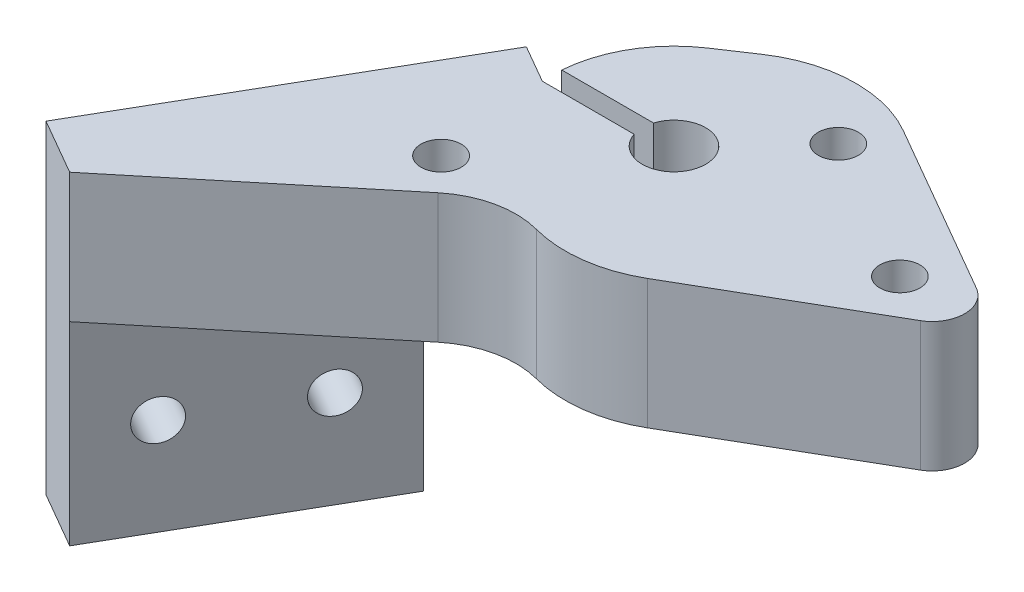
ISO-10303-21;
HEADER;
FILE_DESCRIPTION(('STEP AP214'),'2;1');
FILE_NAME('part.step','',(''),(''),'','','');
FILE_SCHEMA(('AUTOMOTIVE_DESIGN { 1 0 10303 214 1 1 1 1 }'));
ENDSEC;
DATA;
#1=APPLICATION_CONTEXT('core data for automotive mechanical design processes');
#2=APPLICATION_PROTOCOL_DEFINITION('international standard','automotive_design',2000,#1);
#3=PRODUCT_CONTEXT('',#1,'mechanical');
#4=PRODUCT('Part','Part','',(#3));
#5=PRODUCT_RELATED_PRODUCT_CATEGORY('part','',(#4));
#6=PRODUCT_DEFINITION_FORMATION('','',#4);
#7=PRODUCT_DEFINITION_CONTEXT('part definition',#1,'design');
#8=PRODUCT_DEFINITION('design','',#6,#7);
#9=PRODUCT_DEFINITION_SHAPE('','',#8);
#10=(LENGTH_UNIT() NAMED_UNIT(*) SI_UNIT(.MILLI.,.METRE.));
#11=(NAMED_UNIT(*) PLANE_ANGLE_UNIT() SI_UNIT($,.RADIAN.));
#12=(NAMED_UNIT(*) SI_UNIT($,.STERADIAN.) SOLID_ANGLE_UNIT());
#13=UNCERTAINTY_MEASURE_WITH_UNIT(LENGTH_MEASURE(1.E-05),#10,'distance_accuracy_value','');
#14=(GEOMETRIC_REPRESENTATION_CONTEXT(3) GLOBAL_UNCERTAINTY_ASSIGNED_CONTEXT((#13)) GLOBAL_UNIT_ASSIGNED_CONTEXT((#10,
#11,#12)) REPRESENTATION_CONTEXT('',''));
#15=CARTESIAN_POINT('',(0.,0.,0.));
#16=DIRECTION('',(0.,0.,1.));
#17=DIRECTION('',(1.,0.,0.));
#18=AXIS2_PLACEMENT_3D('',#15,#16,#17);
#19=CARTESIAN_POINT('',(-9.95,10.,0.));
#20=DIRECTION('',(0.,-1.,0.));
#21=DIRECTION('',(0.,0.,-1.));
#22=AXIS2_PLACEMENT_3D('',#19,#20,#21);
#23=CYLINDRICAL_SURFACE('',#22,9.45);
#24=CARTESIAN_POINT('',(-9.95,0.,0.));
#25=DIRECTION('',(0.,1.,0.));
#26=DIRECTION('',(0.,0.,1.));
#27=AXIS2_PLACEMENT_3D('',#24,#25,#26);
#28=CIRCLE('',#27,9.45);
#29=CARTESIAN_POINT('',(-15.1916063033956,0.,-7.86308230658969));
#30=VERTEX_POINT('',#29);
#31=CARTESIAN_POINT('',(-19.3701910808646,0.,-0.749999999999998));
#32=VERTEX_POINT('',#31);
#33=EDGE_CURVE('E244',#30,#32,#28,.T.);
#34=ORIENTED_EDGE('',*,*,#33,.T.);
#35=DIRECTION('',(0.,-1.,0.));
#36=VECTOR('',#35,1.);
#37=CARTESIAN_POINT('',(-19.3701910808646,10.,-0.749999999999998));
#38=LINE('',#37,#36);
#39=CARTESIAN_POINT('',(-19.3701910808646,10.,-0.749999999999998));
#40=VERTEX_POINT('',#39);
#41=EDGE_CURVE('E289',#32,#40,#38,.F.);
#42=ORIENTED_EDGE('',*,*,#41,.T.);
#43=CARTESIAN_POINT('',(-9.95,10.,0.));
#44=DIRECTION('',(0.,1.,0.));
#45=DIRECTION('',(0.,0.,1.));
#46=AXIS2_PLACEMENT_3D('',#43,#44,#45);
#47=CIRCLE('',#46,9.45);
#48=CARTESIAN_POINT('',(-15.1916063033956,10.,-7.86308230658969));
#49=VERTEX_POINT('',#48);
#50=EDGE_CURVE('E243',#49,#40,#47,.T.);
#51=ORIENTED_EDGE('',*,*,#50,.F.);
#52=DIRECTION('',(0.,-1.,0.));
#53=VECTOR('',#52,1.);
#54=CARTESIAN_POINT('',(-15.1916063033956,10.,-7.86308230658969));
#55=LINE('',#54,#53);
#56=EDGE_CURVE('E240',#49,#30,#55,.T.);
#57=ORIENTED_EDGE('',*,*,#56,.T.);
#58=EDGE_LOOP('',(#34,#42,#51,#57));
#59=FACE_BOUND('',#58,.T.);
#60=ADVANCED_FACE('F35',(#59),#23,.T.);
#61=CARTESIAN_POINT('',(-7.12122377100341,10.,1.22468911520026));
#62=DIRECTION('',(0.,1.,0.));
#63=DIRECTION('',(0.,0.,1.));
#64=AXIS2_PLACEMENT_3D('',#61,#62,#63);
#65=PLANE('',#64);
#66=CARTESIAN_POINT('',(-18.2979074905355,10.,9.64295726515306));
#67=DIRECTION('',(0.,-1.,0.));
#68=DIRECTION('',(0.,0.,-1.));
#69=AXIS2_PLACEMENT_3D('',#66,#67,#68);
#70=CIRCLE('',#69,1.554);
#71=CARTESIAN_POINT('',(-18.2979074905355,10.,8.08895726515306));
#72=VERTEX_POINT('',#71);
#73=EDGE_CURVE('E626',#72,#72,#70,.T.);
#74=ORIENTED_EDGE('',*,*,#73,.T.);
#75=EDGE_LOOP('',(#74));
#76=FACE_BOUND('',#75,.T.);
#77=DIRECTION('',(-1.,0.,0.));
#78=VECTOR('',#77,1.);
#79=CARTESIAN_POINT('',(-9.95,10.,-0.750000000000002));
#80=LINE('',#79,#78);
#81=CARTESIAN_POINT('',(-12.2823807579381,10.,-0.750000000000001));
#82=VERTEX_POINT('',#81);
#83=EDGE_CURVE('E301',#82,#40,#80,.T.);
#84=ORIENTED_EDGE('',*,*,#83,.F.);
#85=CARTESIAN_POINT('',(-9.95,10.,0.));
#86=DIRECTION('',(0.,1.,0.));
#87=DIRECTION('',(0.,0.,1.));
#88=AXIS2_PLACEMENT_3D('',#85,#86,#87);
#89=CIRCLE('',#88,2.45);
#90=CARTESIAN_POINT('',(-12.2823807579381,10.,0.749999999999998));
#91=VERTEX_POINT('',#90);
#92=EDGE_CURVE('E283',#91,#82,#89,.T.);
#93=ORIENTED_EDGE('',*,*,#92,.F.);
#94=DIRECTION('',(1.,0.,0.));
#95=VECTOR('',#94,1.);
#96=CARTESIAN_POINT('',(-9.95,10.,0.749999999999998));
#97=LINE('',#96,#95);
#98=CARTESIAN_POINT('',(-19.3701910808646,10.,0.75));
#99=VERTEX_POINT('',#98);
#100=EDGE_CURVE('E298',#99,#91,#97,.T.);
#101=ORIENTED_EDGE('',*,*,#100,.F.);
#102=DIRECTION('',(-0.866025403784439,0.,-0.5));
#103=VECTOR('',#102,1.);
#104=CARTESIAN_POINT('',(-5.1673072966353,10.,8.95003877609373));
#105=LINE('',#104,#103);
#106=CARTESIAN_POINT('',(-22.2859905873979,10.,-0.933437629999999));
#107=VERTEX_POINT('',#106);
#108=EDGE_CURVE('E314',#99,#107,#105,.T.);
#109=ORIENTED_EDGE('',*,*,#108,.T.);
#110=DIRECTION('',(-0.500000000000001,0.,0.866025403784438));
#111=VECTOR('',#110,1.);
#112=CARTESIAN_POINT('',(-17.1186832907626,10.,-9.88347640609373));
#113=LINE('',#112,#111);
#114=CARTESIAN_POINT('',(-35.8686831430116,10.,22.5924759799105));
#115=VERTEX_POINT('',#114);
#116=EDGE_CURVE('E317',#107,#115,#113,.T.);
#117=ORIENTED_EDGE('',*,*,#116,.T.);
#118=DIRECTION('',(0.866025403784439,0.,0.5));
#119=VECTOR('',#118,1.);
#120=CARTESIAN_POINT('',(-18.749999852249,10.,32.4759523860042));
#121=LINE('',#120,#119);
#122=CARTESIAN_POINT('',(-31.5385561240894,10.,25.0924759799105));
#123=VERTEX_POINT('',#122);
#124=EDGE_CURVE('E320',#115,#123,#121,.T.);
#125=ORIENTED_EDGE('',*,*,#124,.T.);
#126=DIRECTION('',(0.771799318585592,0.,-0.635866190193201));
#127=VECTOR('',#126,1.);
#128=CARTESIAN_POINT('',(-0.437441388363334,10.,-0.530955994621095));
#129=LINE('',#128,#127);
#130=CARTESIAN_POINT('',(-15.9493712655832,10.,12.2489357674601));
#131=VERTEX_POINT('',#130);
#132=EDGE_CURVE('E303',#123,#131,#129,.T.);
#133=ORIENTED_EDGE('',*,*,#132,.T.);
#134=CARTESIAN_POINT('',(-11.4983079342308,10.,17.6515309975593));
#135=DIRECTION('',(0.,1.,0.));
#136=DIRECTION('',(0.,0.,1.));
#137=AXIS2_PLACEMENT_3D('',#134,#135,#136);
#138=CIRCLE('',#137,7.);
#139=CARTESIAN_POINT('',(-9.69597916113718,10.,10.8875372812938));
#140=VERTEX_POINT('',#139);
#141=EDGE_CURVE('E11',#131,#140,#138,.F.);
#142=ORIENTED_EDGE('',*,*,#141,.T.);
#143=CARTESIAN_POINT('',(-7.12122377100341,10.,1.22468911520026));
#144=DIRECTION('',(0.,1.,0.));
#145=DIRECTION('',(0.,0.,1.));
#146=AXIS2_PLACEMENT_3D('',#143,#144,#145);
#147=CIRCLE('',#146,10.);
#148=CARTESIAN_POINT('',(-2.12122377100337,10.,9.88494315304462));
#149=VERTEX_POINT('',#148);
#150=EDGE_CURVE('E247',#140,#149,#147,.T.);
#151=ORIENTED_EDGE('',*,*,#150,.T.);
#152=DIRECTION('',(0.866025403784439,0.,-0.5));
#153=VECTOR('',#152,1.);
#154=CARTESIAN_POINT('',(-2.12122377100337,10.,9.88494315304462));
#155=LINE('',#154,#153);
#156=CARTESIAN_POINT('',(11.25,10.,2.16506350946111));
#157=VERTEX_POINT('',#156);
#158=EDGE_CURVE('E271',#149,#157,#155,.T.);
#159=ORIENTED_EDGE('',*,*,#158,.T.);
#160=CARTESIAN_POINT('',(10.,10.,0.));
#161=DIRECTION('',(0.,1.,0.));
#162=DIRECTION('',(0.,0.,-1.));
#163=AXIS2_PLACEMENT_3D('',#160,#161,#162);
#164=CIRCLE('',#163,2.5);
#165=CARTESIAN_POINT('',(11.25,10.,-2.16506350946111));
#166=VERTEX_POINT('',#165);
#167=EDGE_CURVE('E269',#157,#166,#164,.T.);
#168=ORIENTED_EDGE('',*,*,#167,.T.);
#169=DIRECTION('',(-0.866025403784439,0.,-0.5));
#170=VECTOR('',#169,1.);
#171=CARTESIAN_POINT('',(11.25,10.,-2.16506350946111));
#172=LINE('',#171,#170);
#173=CARTESIAN_POINT('',(-2.12122377100337,10.,-9.88494315304462));
#174=VERTEX_POINT('',#173);
#175=EDGE_CURVE('E267',#166,#174,#172,.T.);
#176=ORIENTED_EDGE('',*,*,#175,.T.);
#177=CARTESIAN_POINT('',(-7.12122377100341,10.,-1.22468911520026));
#178=DIRECTION('',(0.,1.,0.));
#179=DIRECTION('',(0.,0.,1.));
#180=AXIS2_PLACEMENT_3D('',#177,#178,#179);
#181=CIRCLE('',#180,10.);
#182=CARTESIAN_POINT('',(-12.66789710793,10.,-9.54541113275546));
#183=VERTEX_POINT('',#182);
#184=EDGE_CURVE('E265',#174,#183,#181,.T.);
#185=ORIENTED_EDGE('',*,*,#184,.T.);
#186=DIRECTION('',(-0.832072201755523,0.,0.554667333692653));
#187=VECTOR('',#186,1.);
#188=CARTESIAN_POINT('',(-12.66789710793,10.,-9.54541113275546));
#189=LINE('',#188,#187);
#190=EDGE_CURVE('E263',#183,#49,#189,.T.);
#191=ORIENTED_EDGE('',*,*,#190,.T.);
#192=ORIENTED_EDGE('',*,*,#50,.T.);
#193=EDGE_LOOP('',(#84,#93,#101,#109,#117,#125,#133,#142,#151,#159,#168,#176,#185,#191,#192));
#194=FACE_BOUND('',#193,.T.);
#195=CARTESIAN_POINT('',(-3.75,10.,-6.49519052838329));
#196=DIRECTION('',(0.,1.,0.));
#197=DIRECTION('',(0.,0.,1.));
#198=AXIS2_PLACEMENT_3D('',#195,#196,#197);
#199=CIRCLE('',#198,1.55);
#200=CARTESIAN_POINT('',(-3.75,10.,-4.94519052838329));
#201=VERTEX_POINT('',#200);
#202=EDGE_CURVE('E277',#201,#201,#199,.T.);
#203=ORIENTED_EDGE('',*,*,#202,.F.);
#204=EDGE_LOOP('',(#203));
#205=FACE_BOUND('',#204,.T.);
#206=CARTESIAN_POINT('',(7.5,10.,0.));
#207=DIRECTION('',(0.,1.,0.));
#208=DIRECTION('',(0.,0.,1.));
#209=AXIS2_PLACEMENT_3D('',#206,#207,#208);
#210=CIRCLE('',#209,1.55);
#211=CARTESIAN_POINT('',(7.5,10.,1.55));
#212=VERTEX_POINT('',#211);
#213=EDGE_CURVE('E260',#212,#212,#210,.T.);
#214=ORIENTED_EDGE('',*,*,#213,.F.);
#215=EDGE_LOOP('',(#214));
#216=FACE_BOUND('',#215,.T.);
#217=ADVANCED_FACE('F331',(#76,#194,#205,#216),#65,.T.);
#218=CARTESIAN_POINT('',(-7.12122377100341,0.,1.22468911520026));
#219=DIRECTION('',(0.,1.,0.));
#220=DIRECTION('',(0.,0.,1.));
#221=AXIS2_PLACEMENT_3D('',#218,#219,#220);
#222=PLANE('',#221);
#223=CARTESIAN_POINT('',(-18.2979074905355,0.,9.64295726515306));
#224=DIRECTION('',(0.,-1.,0.));
#225=DIRECTION('',(0.,0.,-1.));
#226=AXIS2_PLACEMENT_3D('',#223,#224,#225);
#227=CIRCLE('',#226,1.55399999999999);
#228=CARTESIAN_POINT('',(-18.2979074905355,0.,8.08895726515307));
#229=VERTEX_POINT('',#228);
#230=EDGE_CURVE('E424',#229,#229,#227,.T.);
#231=ORIENTED_EDGE('',*,*,#230,.F.);
#232=EDGE_LOOP('',(#231));
#233=FACE_BOUND('',#232,.T.);
#234=CARTESIAN_POINT('',(-3.75,0.,-6.49519052838329));
#235=DIRECTION('',(0.,1.,0.));
#236=DIRECTION('',(0.,0.,1.));
#237=AXIS2_PLACEMENT_3D('',#234,#235,#236);
#238=CIRCLE('',#237,1.55);
#239=CARTESIAN_POINT('',(-3.75,0.,-4.94519052838329));
#240=VERTEX_POINT('',#239);
#241=EDGE_CURVE('E280',#240,#240,#238,.T.);
#242=ORIENTED_EDGE('',*,*,#241,.T.);
#243=EDGE_LOOP('',(#242));
#244=FACE_BOUND('',#243,.T.);
#245=DIRECTION('',(0.771799318585592,0.,-0.635866190193201));
#246=VECTOR('',#245,1.);
#247=CARTESIAN_POINT('',(-0.437441388363334,0.,-0.530955994621095));
#248=LINE('',#247,#246);
#249=CARTESIAN_POINT('',(-31.5385561240894,0.,25.0924759799105));
#250=VERTEX_POINT('',#249);
#251=CARTESIAN_POINT('',(-15.9493712655832,0.,12.2489357674601));
#252=VERTEX_POINT('',#251);
#253=EDGE_CURVE('E310',#250,#252,#248,.T.);
#254=ORIENTED_EDGE('',*,*,#253,.F.);
#255=DIRECTION('',(0.500000000000001,0.,-0.866025403784438));
#256=VECTOR('',#255,1.);
#257=CARTESIAN_POINT('',(-31.5385561240894,0.,25.0924759799105));
#258=LINE('',#257,#256);
#259=CARTESIAN_POINT('',(-21.5385561240894,0.,7.77196790422172));
#260=VERTEX_POINT('',#259);
#261=EDGE_CURVE('E161',#250,#260,#258,.T.);
#262=ORIENTED_EDGE('',*,*,#261,.T.);
#263=DIRECTION('',(-0.866025403784438,0.,-0.500000000000001));
#264=VECTOR('',#263,1.);
#265=CARTESIAN_POINT('',(-25.8686831430116,0.,5.27196790422171));
#266=LINE('',#265,#264);
#267=CARTESIAN_POINT('',(-25.8686831430116,0.,5.27196790422171));
#268=VERTEX_POINT('',#267);
#269=EDGE_CURVE('E182',#260,#268,#266,.T.);
#270=ORIENTED_EDGE('',*,*,#269,.T.);
#271=DIRECTION('',(-0.500000000000001,0.,0.866025403784438));
#272=VECTOR('',#271,1.);
#273=CARTESIAN_POINT('',(-17.1186832907626,0.,-9.88347640609373));
#274=LINE('',#273,#272);
#275=CARTESIAN_POINT('',(-22.2859905873979,0.,-0.933437629999999));
#276=VERTEX_POINT('',#275);
#277=EDGE_CURVE('E198',#276,#268,#274,.T.);
#278=ORIENTED_EDGE('',*,*,#277,.F.);
#279=DIRECTION('',(-0.866025403784439,0.,-0.5));
#280=VECTOR('',#279,1.);
#281=CARTESIAN_POINT('',(-5.1673072966353,0.,8.95003877609373));
#282=LINE('',#281,#280);
#283=CARTESIAN_POINT('',(-19.3701910808646,0.,0.75));
#284=VERTEX_POINT('',#283);
#285=EDGE_CURVE('E203',#284,#276,#282,.T.);
#286=ORIENTED_EDGE('',*,*,#285,.F.);
#287=DIRECTION('',(1.,0.,0.));
#288=VECTOR('',#287,1.);
#289=CARTESIAN_POINT('',(-9.95,0.,0.749999999999998));
#290=LINE('',#289,#288);
#291=CARTESIAN_POINT('',(-12.2823807579381,0.,0.749999999999999));
#292=VERTEX_POINT('',#291);
#293=EDGE_CURVE('E297',#284,#292,#290,.T.);
#294=ORIENTED_EDGE('',*,*,#293,.T.);
#295=CARTESIAN_POINT('',(-9.95,0.,0.));
#296=DIRECTION('',(0.,1.,0.));
#297=DIRECTION('',(0.,0.,1.));
#298=AXIS2_PLACEMENT_3D('',#295,#296,#297);
#299=CIRCLE('',#298,2.45);
#300=CARTESIAN_POINT('',(-12.2823807579381,0.,-0.750000000000001));
#301=VERTEX_POINT('',#300);
#302=EDGE_CURVE('E286',#292,#301,#299,.T.);
#303=ORIENTED_EDGE('',*,*,#302,.T.);
#304=DIRECTION('',(-1.,0.,0.));
#305=VECTOR('',#304,1.);
#306=CARTESIAN_POINT('',(-9.95,0.,-0.750000000000002));
#307=LINE('',#306,#305);
#308=EDGE_CURVE('E300',#301,#32,#307,.T.);
#309=ORIENTED_EDGE('',*,*,#308,.T.);
#310=ORIENTED_EDGE('',*,*,#33,.F.);
#311=DIRECTION('',(-0.832072201755523,0.,0.554667333692653));
#312=VECTOR('',#311,1.);
#313=CARTESIAN_POINT('',(-12.66789710793,0.,-9.54541113275546));
#314=LINE('',#313,#312);
#315=CARTESIAN_POINT('',(-12.66789710793,0.,-9.54541113275546));
#316=VERTEX_POINT('',#315);
#317=EDGE_CURVE('E248',#316,#30,#314,.T.);
#318=ORIENTED_EDGE('',*,*,#317,.F.);
#319=CARTESIAN_POINT('',(-7.12122377100341,0.,-1.22468911520026));
#320=DIRECTION('',(0.,1.,0.));
#321=DIRECTION('',(0.,0.,1.));
#322=AXIS2_PLACEMENT_3D('',#319,#320,#321);
#323=CIRCLE('',#322,10.);
#324=CARTESIAN_POINT('',(-2.12122377100337,0.,-9.88494315304462));
#325=VERTEX_POINT('',#324);
#326=EDGE_CURVE('E250',#325,#316,#323,.T.);
#327=ORIENTED_EDGE('',*,*,#326,.F.);
#328=DIRECTION('',(-0.866025403784439,0.,-0.5));
#329=VECTOR('',#328,1.);
#330=CARTESIAN_POINT('',(11.25,0.,-2.16506350946111));
#331=LINE('',#330,#329);
#332=CARTESIAN_POINT('',(11.25,0.,-2.16506350946111));
#333=VERTEX_POINT('',#332);
#334=EDGE_CURVE('E252',#333,#325,#331,.T.);
#335=ORIENTED_EDGE('',*,*,#334,.F.);
#336=CARTESIAN_POINT('',(10.,0.,0.));
#337=DIRECTION('',(0.,1.,0.));
#338=DIRECTION('',(0.,0.,-1.));
#339=AXIS2_PLACEMENT_3D('',#336,#337,#338);
#340=CIRCLE('',#339,2.5);
#341=CARTESIAN_POINT('',(11.25,0.,2.16506350946111));
#342=VERTEX_POINT('',#341);
#343=EDGE_CURVE('E254',#342,#333,#340,.T.);
#344=ORIENTED_EDGE('',*,*,#343,.F.);
#345=DIRECTION('',(0.866025403784439,0.,-0.5));
#346=VECTOR('',#345,1.);
#347=CARTESIAN_POINT('',(-2.12122377100337,0.,9.88494315304462));
#348=LINE('',#347,#346);
#349=CARTESIAN_POINT('',(-2.12122377100337,0.,9.88494315304462));
#350=VERTEX_POINT('',#349);
#351=EDGE_CURVE('E256',#350,#342,#348,.T.);
#352=ORIENTED_EDGE('',*,*,#351,.F.);
#353=CARTESIAN_POINT('',(-7.12122377100341,0.,1.22468911520026));
#354=DIRECTION('',(0.,1.,0.));
#355=DIRECTION('',(0.,0.,1.));
#356=AXIS2_PLACEMENT_3D('',#353,#354,#355);
#357=CIRCLE('',#356,10.);
#358=CARTESIAN_POINT('',(-9.69597916113718,0.,10.8875372812938));
#359=VERTEX_POINT('',#358);
#360=EDGE_CURVE('E258',#359,#350,#357,.T.);
#361=ORIENTED_EDGE('',*,*,#360,.F.);
#362=CARTESIAN_POINT('',(-11.4983079342308,0.,17.6515309975593));
#363=DIRECTION('',(0.,1.,0.));
#364=DIRECTION('',(0.,0.,1.));
#365=AXIS2_PLACEMENT_3D('',#362,#363,#364);
#366=CIRCLE('',#365,7.);
#367=EDGE_CURVE('E43',#359,#252,#366,.T.);
#368=ORIENTED_EDGE('',*,*,#367,.T.);
#369=EDGE_LOOP('',(#254,#262,#270,#278,#286,#294,#303,#309,#310,#318,#327,#335,#344,#352,#361,#368));
#370=FACE_BOUND('',#369,.T.);
#371=CARTESIAN_POINT('',(7.5,0.,0.));
#372=DIRECTION('',(0.,1.,0.));
#373=DIRECTION('',(0.,0.,1.));
#374=AXIS2_PLACEMENT_3D('',#371,#372,#373);
#375=CIRCLE('',#374,1.55);
#376=CARTESIAN_POINT('',(7.5,0.,1.55));
#377=VERTEX_POINT('',#376);
#378=EDGE_CURVE('E274',#377,#377,#375,.T.);
#379=ORIENTED_EDGE('',*,*,#378,.T.);
#380=EDGE_LOOP('',(#379));
#381=FACE_BOUND('',#380,.T.);
#382=ADVANCED_FACE('F364',(#233,#244,#370,#381),#222,.F.);
#383=CARTESIAN_POINT('',(-7.12122377100341,10.,1.22468911520026));
#384=DIRECTION('',(0.,-1.,0.));
#385=DIRECTION('',(0.,0.,-1.));
#386=AXIS2_PLACEMENT_3D('',#383,#384,#385);
#387=CYLINDRICAL_SURFACE('',#386,10.);
#388=ORIENTED_EDGE('',*,*,#150,.F.);
#389=DIRECTION('',(0.,-1.,0.));
#390=VECTOR('',#389,1.);
#391=CARTESIAN_POINT('',(-9.69597916113718,10.,10.8875372812938));
#392=LINE('',#391,#390);
#393=EDGE_CURVE('E212',#140,#359,#392,.T.);
#394=ORIENTED_EDGE('',*,*,#393,.T.);
#395=ORIENTED_EDGE('',*,*,#360,.T.);
#396=DIRECTION('',(0.,-1.,0.));
#397=VECTOR('',#396,1.);
#398=CARTESIAN_POINT('',(-2.12122377100337,10.,9.88494315304462));
#399=LINE('',#398,#397);
#400=EDGE_CURVE('E223',#149,#350,#399,.T.);
#401=ORIENTED_EDGE('',*,*,#400,.F.);
#402=EDGE_LOOP('',(#388,#394,#395,#401));
#403=FACE_BOUND('',#402,.T.);
#404=ADVANCED_FACE('F335',(#403),#387,.T.);
#405=CARTESIAN_POINT('',(-2.12122377100337,10.,9.88494315304462));
#406=DIRECTION('',(-0.5,0.,-0.866025403784439));
#407=DIRECTION('',(-0.866025403784439,0.,0.5));
#408=AXIS2_PLACEMENT_3D('',#405,#406,#407);
#409=PLANE('',#408);
#410=ORIENTED_EDGE('',*,*,#351,.T.);
#411=DIRECTION('',(0.,-1.,0.));
#412=VECTOR('',#411,1.);
#413=CARTESIAN_POINT('',(11.25,10.,2.16506350946111));
#414=LINE('',#413,#412);
#415=EDGE_CURVE('E228',#157,#342,#414,.T.);
#416=ORIENTED_EDGE('',*,*,#415,.F.);
#417=ORIENTED_EDGE('',*,*,#158,.F.);
#418=ORIENTED_EDGE('',*,*,#400,.T.);
#419=EDGE_LOOP('',(#410,#416,#417,#418));
#420=FACE_BOUND('',#419,.T.);
#421=ADVANCED_FACE('F338',(#420),#409,.F.);
#422=CARTESIAN_POINT('',(10.,10.,0.));
#423=DIRECTION('',(0.,-1.,0.));
#424=DIRECTION('',(0.,0.,-1.));
#425=AXIS2_PLACEMENT_3D('',#422,#423,#424);
#426=CYLINDRICAL_SURFACE('',#425,2.5);
#427=ORIENTED_EDGE('',*,*,#343,.T.);
#428=DIRECTION('',(0.,-1.,0.));
#429=VECTOR('',#428,1.);
#430=CARTESIAN_POINT('',(11.25,10.,-2.16506350946111));
#431=LINE('',#430,#429);
#432=EDGE_CURVE('E231',#166,#333,#431,.T.);
#433=ORIENTED_EDGE('',*,*,#432,.F.);
#434=ORIENTED_EDGE('',*,*,#167,.F.);
#435=ORIENTED_EDGE('',*,*,#415,.T.);
#436=EDGE_LOOP('',(#427,#433,#434,#435));
#437=FACE_BOUND('',#436,.T.);
#438=ADVANCED_FACE('F345',(#437),#426,.T.);
#439=CARTESIAN_POINT('',(11.25,10.,-2.16506350946111));
#440=DIRECTION('',(-0.5,0.,0.866025403784439));
#441=DIRECTION('',(0.866025403784439,0.,0.5));
#442=AXIS2_PLACEMENT_3D('',#439,#440,#441);
#443=PLANE('',#442);
#444=ORIENTED_EDGE('',*,*,#334,.T.);
#445=DIRECTION('',(0.,-1.,0.));
#446=VECTOR('',#445,1.);
#447=CARTESIAN_POINT('',(-2.12122377100337,10.,-9.88494315304462));
#448=LINE('',#447,#446);
#449=EDGE_CURVE('E234',#174,#325,#448,.T.);
#450=ORIENTED_EDGE('',*,*,#449,.F.);
#451=ORIENTED_EDGE('',*,*,#175,.F.);
#452=ORIENTED_EDGE('',*,*,#432,.T.);
#453=EDGE_LOOP('',(#444,#450,#451,#452));
#454=FACE_BOUND('',#453,.T.);
#455=ADVANCED_FACE('F349',(#454),#443,.F.);
#456=CARTESIAN_POINT('',(-7.12122377100341,10.,-1.22468911520026));
#457=DIRECTION('',(0.,-1.,0.));
#458=DIRECTION('',(0.,0.,-1.));
#459=AXIS2_PLACEMENT_3D('',#456,#457,#458);
#460=CYLINDRICAL_SURFACE('',#459,10.);
#461=ORIENTED_EDGE('',*,*,#326,.T.);
#462=DIRECTION('',(0.,-1.,0.));
#463=VECTOR('',#462,1.);
#464=CARTESIAN_POINT('',(-12.66789710793,10.,-9.54541113275546));
#465=LINE('',#464,#463);
#466=EDGE_CURVE('E237',#183,#316,#465,.T.);
#467=ORIENTED_EDGE('',*,*,#466,.F.);
#468=ORIENTED_EDGE('',*,*,#184,.F.);
#469=ORIENTED_EDGE('',*,*,#449,.T.);
#470=EDGE_LOOP('',(#461,#467,#468,#469));
#471=FACE_BOUND('',#470,.T.);
#472=ADVANCED_FACE('F354',(#471),#460,.T.);
#473=CARTESIAN_POINT('',(-12.66789710793,10.,-9.54541113275546));
#474=DIRECTION('',(0.554667333692653,0.,0.832072201755523));
#475=DIRECTION('',(0.832072201755523,0.,-0.554667333692653));
#476=AXIS2_PLACEMENT_3D('',#473,#474,#475);
#477=PLANE('',#476);
#478=ORIENTED_EDGE('',*,*,#317,.T.);
#479=ORIENTED_EDGE('',*,*,#56,.F.);
#480=ORIENTED_EDGE('',*,*,#190,.F.);
#481=ORIENTED_EDGE('',*,*,#466,.T.);
#482=EDGE_LOOP('',(#478,#479,#480,#481));
#483=FACE_BOUND('',#482,.T.);
#484=ADVANCED_FACE('F359',(#483),#477,.F.);
#485=CARTESIAN_POINT('',(7.5,10.,0.));
#486=DIRECTION('',(0.,-1.,0.));
#487=DIRECTION('',(0.,0.,-1.));
#488=AXIS2_PLACEMENT_3D('',#485,#486,#487);
#489=CYLINDRICAL_SURFACE('',#488,1.55);
#490=ORIENTED_EDGE('',*,*,#213,.T.);
#491=EDGE_LOOP('',(#490));
#492=FACE_BOUND('',#491,.T.);
#493=ORIENTED_EDGE('',*,*,#378,.F.);
#494=EDGE_LOOP('',(#493));
#495=FACE_BOUND('',#494,.T.);
#496=ADVANCED_FACE('F406',(#492,#495),#489,.F.);
#497=CARTESIAN_POINT('',(-3.75,10.,-6.49519052838329));
#498=DIRECTION('',(0.,-1.,0.));
#499=DIRECTION('',(0.,0.,-1.));
#500=AXIS2_PLACEMENT_3D('',#497,#498,#499);
#501=CYLINDRICAL_SURFACE('',#500,1.55);
#502=ORIENTED_EDGE('',*,*,#202,.T.);
#503=EDGE_LOOP('',(#502));
#504=FACE_BOUND('',#503,.T.);
#505=ORIENTED_EDGE('',*,*,#241,.F.);
#506=EDGE_LOOP('',(#505));
#507=FACE_BOUND('',#506,.T.);
#508=ADVANCED_FACE('F427',(#504,#507),#501,.F.);
#509=CARTESIAN_POINT('',(-9.95,10.,0.));
#510=DIRECTION('',(0.,-1.,0.));
#511=DIRECTION('',(0.,0.,-1.));
#512=AXIS2_PLACEMENT_3D('',#509,#510,#511);
#513=CYLINDRICAL_SURFACE('',#512,2.45);
#514=DIRECTION('',(0.,-1.,0.));
#515=VECTOR('',#514,1.);
#516=CARTESIAN_POINT('',(-12.2823807579381,10.,-0.750000000000001));
#517=LINE('',#516,#515);
#518=EDGE_CURVE('E215',#301,#82,#517,.F.);
#519=ORIENTED_EDGE('',*,*,#518,.F.);
#520=ORIENTED_EDGE('',*,*,#302,.F.);
#521=DIRECTION('',(0.,-1.,0.));
#522=VECTOR('',#521,1.);
#523=CARTESIAN_POINT('',(-12.2823807579381,10.,0.749999999999999));
#524=LINE('',#523,#522);
#525=EDGE_CURVE('E219',#91,#292,#524,.T.);
#526=ORIENTED_EDGE('',*,*,#525,.F.);
#527=ORIENTED_EDGE('',*,*,#92,.T.);
#528=EDGE_LOOP('',(#519,#520,#526,#527));
#529=FACE_BOUND('',#528,.T.);
#530=ADVANCED_FACE('F370',(#529),#513,.F.);
#531=CARTESIAN_POINT('',(-9.95,0.,0.749999999999998));
#532=DIRECTION('',(0.,0.,1.));
#533=DIRECTION('',(1.,0.,0.));
#534=AXIS2_PLACEMENT_3D('',#531,#532,#533);
#535=PLANE('',#534);
#536=ORIENTED_EDGE('',*,*,#100,.T.);
#537=ORIENTED_EDGE('',*,*,#525,.T.);
#538=ORIENTED_EDGE('',*,*,#293,.F.);
#539=DIRECTION('',(0.,-1.,0.));
#540=VECTOR('',#539,1.);
#541=CARTESIAN_POINT('',(-19.3701910808646,10.,0.75));
#542=LINE('',#541,#540);
#543=EDGE_CURVE('E294',#99,#284,#542,.T.);
#544=ORIENTED_EDGE('',*,*,#543,.F.);
#545=EDGE_LOOP('',(#536,#537,#538,#544));
#546=FACE_BOUND('',#545,.T.);
#547=ADVANCED_FACE('F435',(#546),#535,.F.);
#548=CARTESIAN_POINT('',(-9.95,0.,-0.750000000000002));
#549=DIRECTION('',(0.,0.,-1.));
#550=DIRECTION('',(-1.,0.,0.));
#551=AXIS2_PLACEMENT_3D('',#548,#549,#550);
#552=PLANE('',#551);
#553=ORIENTED_EDGE('',*,*,#308,.F.);
#554=ORIENTED_EDGE('',*,*,#518,.T.);
#555=ORIENTED_EDGE('',*,*,#83,.T.);
#556=ORIENTED_EDGE('',*,*,#41,.F.);
#557=EDGE_LOOP('',(#553,#554,#555,#556));
#558=FACE_BOUND('',#557,.T.);
#559=ADVANCED_FACE('F363',(#558),#552,.F.);
#560=CARTESIAN_POINT('',(-5.1673072966353,44.8658092101153,8.95003877609373));
#561=DIRECTION('',(-0.5,0.,0.866025403784439));
#562=DIRECTION('',(0.866025403784439,0.,0.5));
#563=AXIS2_PLACEMENT_3D('',#560,#561,#562);
#564=PLANE('',#563);
#565=ORIENTED_EDGE('',*,*,#108,.F.);
#566=ORIENTED_EDGE('',*,*,#543,.T.);
#567=ORIENTED_EDGE('',*,*,#285,.T.);
#568=DIRECTION('',(0.,-1.,0.));
#569=VECTOR('',#568,1.);
#570=CARTESIAN_POINT('',(-22.2859905873979,44.8658092101153,-0.933437629999999));
#571=LINE('',#570,#569);
#572=EDGE_CURVE('E312',#107,#276,#571,.T.);
#573=ORIENTED_EDGE('',*,*,#572,.F.);
#574=EDGE_LOOP('',(#565,#566,#567,#573));
#575=FACE_BOUND('',#574,.T.);
#576=ADVANCED_FACE('F377',(#575),#564,.F.);
#577=CARTESIAN_POINT('',(-17.1186832907626,44.8658092101153,-9.88347640609373));
#578=DIRECTION('',(0.866025403784438,0.,0.500000000000001));
#579=DIRECTION('',(0.500000000000001,0.,-0.866025403784438));
#580=AXIS2_PLACEMENT_3D('',#577,#578,#579);
#581=PLANE('',#580);
#582=CARTESIAN_POINT('',(-28.3686831430116,-7.5,9.6020949231439));
#583=DIRECTION('',(0.866025403784438,0.,0.500000000000001));
#584=DIRECTION('',(0.500000000000001,0.,-0.866025403784438));
#585=AXIS2_PLACEMENT_3D('',#582,#583,#584);
#586=CIRCLE('',#585,1.554);
#587=CARTESIAN_POINT('',(-27.5916831430116,-7.5,8.25629144566289));
#588=VERTEX_POINT('',#587);
#589=EDGE_CURVE('E208',#588,#588,#586,.T.);
#590=ORIENTED_EDGE('',*,*,#589,.T.);
#591=EDGE_LOOP('',(#590));
#592=FACE_BOUND('',#591,.T.);
#593=CARTESIAN_POINT('',(-33.3686831430116,-7.5,18.2623489609883));
#594=DIRECTION('',(0.866025403784438,0.,0.500000000000001));
#595=DIRECTION('',(0.500000000000001,0.,-0.866025403784438));
#596=AXIS2_PLACEMENT_3D('',#593,#594,#595);
#597=CIRCLE('',#596,1.554);
#598=CARTESIAN_POINT('',(-32.5916831430116,-7.5,16.9165454835073));
#599=VERTEX_POINT('',#598);
#600=EDGE_CURVE('E193',#599,#599,#597,.T.);
#601=ORIENTED_EDGE('',*,*,#600,.T.);
#602=EDGE_LOOP('',(#601));
#603=FACE_BOUND('',#602,.T.);
#604=ORIENTED_EDGE('',*,*,#116,.F.);
#605=ORIENTED_EDGE('',*,*,#572,.T.);
#606=ORIENTED_EDGE('',*,*,#277,.T.);
#607=DIRECTION('',(0.,1.,0.));
#608=VECTOR('',#607,1.);
#609=CARTESIAN_POINT('',(-25.8686831430116,-15.,5.27196790422171));
#610=LINE('',#609,#608);
#611=CARTESIAN_POINT('',(-25.8686831430116,-15.,5.27196790422171));
#612=VERTEX_POINT('',#611);
#613=EDGE_CURVE('E201',#612,#268,#610,.T.);
#614=ORIENTED_EDGE('',*,*,#613,.F.);
#615=DIRECTION('',(-0.5,0.,0.866025403784438));
#616=VECTOR('',#615,1.);
#617=CARTESIAN_POINT('',(-35.8686831430116,-15.,22.5924759799105));
#618=LINE('',#617,#616);
#619=CARTESIAN_POINT('',(-35.8686831430116,-15.,22.5924759799105));
#620=VERTEX_POINT('',#619);
#621=EDGE_CURVE('E167',#612,#620,#618,.T.);
#622=ORIENTED_EDGE('',*,*,#621,.T.);
#623=DIRECTION('',(0.,-1.,0.));
#624=VECTOR('',#623,1.);
#625=CARTESIAN_POINT('',(-35.8686831430116,44.8658092101153,22.5924759799105));
#626=LINE('',#625,#624);
#627=EDGE_CURVE('E181',#115,#620,#626,.T.);
#628=ORIENTED_EDGE('',*,*,#627,.F.);
#629=EDGE_LOOP('',(#604,#605,#606,#614,#622,#628));
#630=FACE_BOUND('',#629,.T.);
#631=ADVANCED_FACE('F381',(#592,#603,#630),#581,.F.);
#632=CARTESIAN_POINT('',(-18.749999852249,44.8658092101153,32.4759523860042));
#633=DIRECTION('',(0.5,0.,-0.866025403784439));
#634=DIRECTION('',(-0.866025403784439,0.,-0.5));
#635=AXIS2_PLACEMENT_3D('',#632,#633,#634);
#636=PLANE('',#635);
#637=ORIENTED_EDGE('',*,*,#124,.F.);
#638=ORIENTED_EDGE('',*,*,#627,.T.);
#639=DIRECTION('',(0.866025403784438,0.,0.5));
#640=VECTOR('',#639,1.);
#641=CARTESIAN_POINT('',(-35.8686831430116,-15.,22.5924759799105));
#642=LINE('',#641,#640);
#643=CARTESIAN_POINT('',(-31.5385561240894,-15.,25.0924759799105));
#644=VERTEX_POINT('',#643);
#645=EDGE_CURVE('E174',#620,#644,#642,.T.);
#646=ORIENTED_EDGE('',*,*,#645,.T.);
#647=DIRECTION('',(0.,1.,0.));
#648=VECTOR('',#647,1.);
#649=CARTESIAN_POINT('',(-31.5385561240894,-15.,25.0924759799105));
#650=LINE('',#649,#648);
#651=EDGE_CURVE('E156',#644,#250,#650,.T.);
#652=ORIENTED_EDGE('',*,*,#651,.T.);
#653=DIRECTION('',(0.,-1.,0.));
#654=VECTOR('',#653,1.);
#655=CARTESIAN_POINT('',(-31.5385561240894,44.8658092101153,25.0924759799105));
#656=LINE('',#655,#654);
#657=EDGE_CURVE('E308',#123,#250,#656,.T.);
#658=ORIENTED_EDGE('',*,*,#657,.F.);
#659=EDGE_LOOP('',(#637,#638,#646,#652,#658));
#660=FACE_BOUND('',#659,.T.);
#661=ADVANCED_FACE('F179',(#660),#636,.F.);
#662=CARTESIAN_POINT('',(-0.437441388363334,44.8658092101153,-0.530955994621095));
#663=DIRECTION('',(-0.635866190193201,0.,-0.771799318585592));
#664=DIRECTION('',(-0.771799318585592,0.,0.635866190193201));
#665=AXIS2_PLACEMENT_3D('',#662,#663,#664);
#666=PLANE('',#665);
#667=ORIENTED_EDGE('',*,*,#253,.T.);
#668=DIRECTION('',(0.,1.,0.));
#669=VECTOR('',#668,1.);
#670=CARTESIAN_POINT('',(-15.9493712655832,10.,12.2489357674601));
#671=LINE('',#670,#669);
#672=EDGE_CURVE('E56',#252,#131,#671,.T.);
#673=ORIENTED_EDGE('',*,*,#672,.T.);
#674=ORIENTED_EDGE('',*,*,#132,.F.);
#675=ORIENTED_EDGE('',*,*,#657,.T.);
#676=EDGE_LOOP('',(#667,#673,#674,#675));
#677=FACE_BOUND('',#676,.T.);
#678=ADVANCED_FACE('F327',(#677),#666,.F.);
#679=CARTESIAN_POINT('',(-25.8686831430116,-15.,5.27196790422171));
#680=DIRECTION('',(0.500000000000001,0.,-0.866025403784438));
#681=DIRECTION('',(-0.866025403784438,0.,-0.500000000000001));
#682=AXIS2_PLACEMENT_3D('',#679,#680,#681);
#683=PLANE('',#682);
#684=ORIENTED_EDGE('',*,*,#269,.F.);
#685=DIRECTION('',(0.,1.,0.));
#686=VECTOR('',#685,1.);
#687=CARTESIAN_POINT('',(-21.5385561240894,-15.,7.77196790422172));
#688=LINE('',#687,#686);
#689=CARTESIAN_POINT('',(-21.5385561240894,-15.,7.77196790422172));
#690=VERTEX_POINT('',#689);
#691=EDGE_CURVE('E166',#690,#260,#688,.T.);
#692=ORIENTED_EDGE('',*,*,#691,.F.);
#693=DIRECTION('',(-0.866025403784438,0.,-0.500000000000001));
#694=VECTOR('',#693,1.);
#695=CARTESIAN_POINT('',(-25.8686831430116,-15.,5.27196790422171));
#696=LINE('',#695,#694);
#697=EDGE_CURVE('E177',#690,#612,#696,.T.);
#698=ORIENTED_EDGE('',*,*,#697,.T.);
#699=ORIENTED_EDGE('',*,*,#613,.T.);
#700=EDGE_LOOP('',(#684,#692,#698,#699));
#701=FACE_BOUND('',#700,.T.);
#702=ADVANCED_FACE('F384',(#701),#683,.T.);
#703=CARTESIAN_POINT('',(-31.5385561240894,-15.,25.0924759799105));
#704=DIRECTION('',(0.866025403784438,0.,0.500000000000001));
#705=DIRECTION('',(0.500000000000001,0.,-0.866025403784438));
#706=AXIS2_PLACEMENT_3D('',#703,#704,#705);
#707=PLANE('',#706);
#708=CARTESIAN_POINT('',(-24.0385561240894,-7.5,12.1020949231439));
#709=DIRECTION('',(0.866025403784438,0.,0.500000000000001));
#710=DIRECTION('',(0.500000000000001,0.,-0.866025403784438));
#711=AXIS2_PLACEMENT_3D('',#708,#709,#710);
#712=CIRCLE('',#711,1.554);
#713=CARTESIAN_POINT('',(-23.2615561240894,-7.5,10.7562914456629));
#714=VERTEX_POINT('',#713);
#715=EDGE_CURVE('E211',#714,#714,#712,.T.);
#716=ORIENTED_EDGE('',*,*,#715,.F.);
#717=EDGE_LOOP('',(#716));
#718=FACE_BOUND('',#717,.T.);
#719=CARTESIAN_POINT('',(-29.0385561240894,-7.5,20.7623489609883));
#720=DIRECTION('',(0.866025403784438,0.,0.500000000000001));
#721=DIRECTION('',(0.500000000000001,0.,-0.866025403784438));
#722=AXIS2_PLACEMENT_3D('',#719,#720,#721);
#723=CIRCLE('',#722,1.554);
#724=CARTESIAN_POINT('',(-28.2615561240894,-7.5,19.4165454835073));
#725=VERTEX_POINT('',#724);
#726=EDGE_CURVE('E187',#725,#725,#723,.T.);
#727=ORIENTED_EDGE('',*,*,#726,.F.);
#728=EDGE_LOOP('',(#727));
#729=FACE_BOUND('',#728,.T.);
#730=ORIENTED_EDGE('',*,*,#261,.F.);
#731=ORIENTED_EDGE('',*,*,#651,.F.);
#732=DIRECTION('',(0.500000000000001,0.,-0.866025403784438));
#733=VECTOR('',#732,1.);
#734=CARTESIAN_POINT('',(-31.5385561240894,-15.,25.0924759799105));
#735=LINE('',#734,#733);
#736=EDGE_CURVE('E159',#644,#690,#735,.T.);
#737=ORIENTED_EDGE('',*,*,#736,.T.);
#738=ORIENTED_EDGE('',*,*,#691,.T.);
#739=EDGE_LOOP('',(#730,#731,#737,#738));
#740=FACE_BOUND('',#739,.T.);
#741=ADVANCED_FACE('F158',(#718,#729,#740),#707,.T.);
#742=CARTESIAN_POINT('',(0.,-15.,0.));
#743=DIRECTION('',(0.,1.,0.));
#744=DIRECTION('',(0.,0.,1.));
#745=AXIS2_PLACEMENT_3D('',#742,#743,#744);
#746=PLANE('',#745);
#747=ORIENTED_EDGE('',*,*,#645,.F.);
#748=ORIENTED_EDGE('',*,*,#621,.F.);
#749=ORIENTED_EDGE('',*,*,#697,.F.);
#750=ORIENTED_EDGE('',*,*,#736,.F.);
#751=EDGE_LOOP('',(#747,#748,#749,#750));
#752=FACE_BOUND('',#751,.T.);
#753=ADVANCED_FACE('F172',(#752),#746,.F.);
#754=CARTESIAN_POINT('',(-29.0385561240894,-7.5,20.7623489609883));
#755=DIRECTION('',(0.866025403784438,0.,0.500000000000001));
#756=DIRECTION('',(0.500000000000001,0.,-0.866025403784438));
#757=AXIS2_PLACEMENT_3D('',#754,#755,#756);
#758=CYLINDRICAL_SURFACE('',#757,1.554);
#759=ORIENTED_EDGE('',*,*,#726,.T.);
#760=EDGE_LOOP('',(#759));
#761=FACE_BOUND('',#760,.T.);
#762=ORIENTED_EDGE('',*,*,#600,.F.);
#763=EDGE_LOOP('',(#762));
#764=FACE_BOUND('',#763,.T.);
#765=ADVANCED_FACE('F488',(#761,#764),#758,.F.);
#766=CARTESIAN_POINT('',(-24.0385561240894,-7.5,12.1020949231439));
#767=DIRECTION('',(0.866025403784438,0.,0.500000000000001));
#768=DIRECTION('',(0.500000000000001,0.,-0.866025403784438));
#769=AXIS2_PLACEMENT_3D('',#766,#767,#768);
#770=CYLINDRICAL_SURFACE('',#769,1.554);
#771=ORIENTED_EDGE('',*,*,#715,.T.);
#772=EDGE_LOOP('',(#771));
#773=FACE_BOUND('',#772,.T.);
#774=ORIENTED_EDGE('',*,*,#589,.F.);
#775=EDGE_LOOP('',(#774));
#776=FACE_BOUND('',#775,.T.);
#777=ADVANCED_FACE('F480',(#773,#776),#770,.F.);
#778=CARTESIAN_POINT('',(-18.2979074905355,0.,9.64295726515306));
#779=DIRECTION('',(0.,-1.,0.));
#780=DIRECTION('',(0.,0.,-1.));
#781=AXIS2_PLACEMENT_3D('',#778,#779,#780);
#782=CYLINDRICAL_SURFACE('',#781,1.55399999999999);
#783=ORIENTED_EDGE('',*,*,#73,.F.);
#784=EDGE_LOOP('',(#783));
#785=FACE_BOUND('',#784,.T.);
#786=ORIENTED_EDGE('',*,*,#230,.T.);
#787=EDGE_LOOP('',(#786));
#788=FACE_BOUND('',#787,.T.);
#789=ADVANCED_FACE('F471',(#785,#788),#782,.F.);
#790=CARTESIAN_POINT('',(-11.4983079342308,10.,17.6515309975593));
#791=DIRECTION('',(0.,-1.,0.));
#792=DIRECTION('',(0.,0.,-1.));
#793=AXIS2_PLACEMENT_3D('',#790,#791,#792);
#794=CYLINDRICAL_SURFACE('',#793,7.);
#795=ORIENTED_EDGE('',*,*,#141,.F.);
#796=ORIENTED_EDGE('',*,*,#672,.F.);
#797=ORIENTED_EDGE('',*,*,#367,.F.);
#798=ORIENTED_EDGE('',*,*,#393,.F.);
#799=EDGE_LOOP('',(#795,#796,#797,#798));
#800=FACE_BOUND('',#799,.T.);
#801=ADVANCED_FACE('F37',(#800),#794,.F.);
#802=CLOSED_SHELL('',(#60,#217,#382,#404,#421,#438,#455,#472,#484,#496,#508,#530,#547,#559,#576,
#631,#661,#678,#702,#741,#753,#765,#777,#789,#801));
#803=MANIFOLD_SOLID_BREP('B2',#802);
#804=ADVANCED_BREP_SHAPE_REPRESENTATION('',(#18,#803),#14);
#805=SHAPE_DEFINITION_REPRESENTATION(#9,#804);
ENDSEC;
END-ISO-10303-21;
